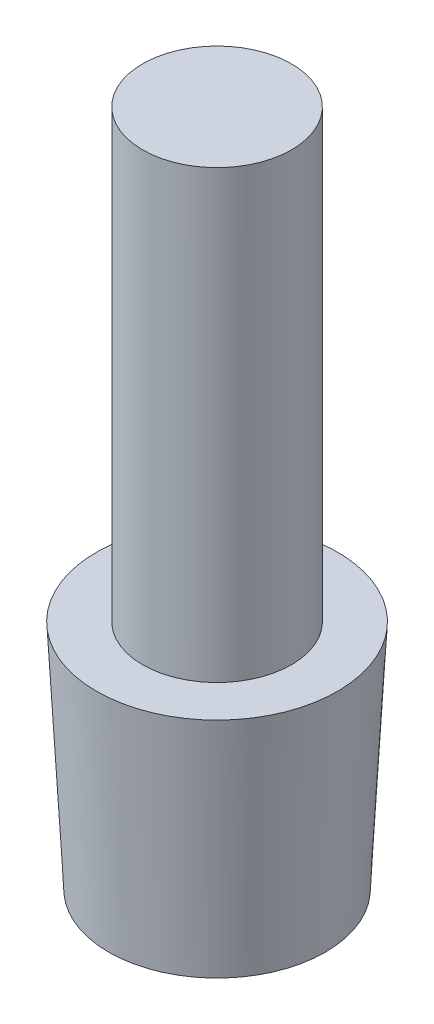
ISO-10303-21;
HEADER;
FILE_DESCRIPTION(('STEP AP214'),'2;1');
FILE_NAME('part.step','',(''),(''),'','','');
FILE_SCHEMA(('AUTOMOTIVE_DESIGN { 1 0 10303 214 1 1 1 1 }'));
ENDSEC;
DATA;
#1=APPLICATION_CONTEXT('core data for automotive mechanical design processes');
#2=APPLICATION_PROTOCOL_DEFINITION('international standard','automotive_design',2000,#1);
#3=PRODUCT_CONTEXT('',#1,'mechanical');
#4=PRODUCT('Part','Part','',(#3));
#5=PRODUCT_RELATED_PRODUCT_CATEGORY('part','',(#4));
#6=PRODUCT_DEFINITION_FORMATION('','',#4);
#7=PRODUCT_DEFINITION_CONTEXT('part definition',#1,'design');
#8=PRODUCT_DEFINITION('design','',#6,#7);
#9=PRODUCT_DEFINITION_SHAPE('','',#8);
#10=(LENGTH_UNIT() NAMED_UNIT(*) SI_UNIT(.MILLI.,.METRE.));
#11=(NAMED_UNIT(*) PLANE_ANGLE_UNIT() SI_UNIT($,.RADIAN.));
#12=(NAMED_UNIT(*) SI_UNIT($,.STERADIAN.) SOLID_ANGLE_UNIT());
#13=UNCERTAINTY_MEASURE_WITH_UNIT(LENGTH_MEASURE(1.E-05),#10,'distance_accuracy_value','');
#14=(GEOMETRIC_REPRESENTATION_CONTEXT(3) GLOBAL_UNCERTAINTY_ASSIGNED_CONTEXT((#13)) GLOBAL_UNIT_ASSIGNED_CONTEXT((#10,
#11,#12)) REPRESENTATION_CONTEXT('',''));
#15=CARTESIAN_POINT('',(0.,0.,0.));
#16=DIRECTION('',(0.,0.,1.));
#17=DIRECTION('',(1.,0.,0.));
#18=AXIS2_PLACEMENT_3D('',#15,#16,#17);
#19=CARTESIAN_POINT('',(0.,-26.1444340560536,0.));
#20=DIRECTION('',(0.,1.,0.));
#21=DIRECTION('',(1.,0.,0.));
#22=AXIS2_PLACEMENT_3D('',#19,#20,#21);
#23=PLANE('',#22);
#24=CARTESIAN_POINT('',(0.,-26.1444340560536,0.));
#25=DIRECTION('',(0.,1.,0.));
#26=DIRECTION('',(0.,0.,1.));
#27=AXIS2_PLACEMENT_3D('',#24,#25,#26);
#28=CIRCLE('',#27,8.);
#29=CARTESIAN_POINT('',(0.,-26.1444340560536,8.));
#30=VERTEX_POINT('',#29);
#31=EDGE_CURVE('E11',#30,#30,#28,.T.);
#32=ORIENTED_EDGE('',*,*,#31,.F.);
#33=EDGE_LOOP('',(#32));
#34=FACE_BOUND('',#33,.T.);
#35=ADVANCED_FACE('F17',(#34),#23,.F.);
#36=CARTESIAN_POINT('',(0.,-9.0164058224241,0.));
#37=DIRECTION('',(0.,1.,0.));
#38=DIRECTION('',(1.,0.,0.));
#39=AXIS2_PLACEMENT_3D('',#36,#37,#38);
#40=PLANE('',#39);
#41=CARTESIAN_POINT('',(0.,-9.0164058224241,0.));
#42=DIRECTION('',(0.,1.,0.));
#43=DIRECTION('',(0.,0.,1.));
#44=AXIS2_PLACEMENT_3D('',#41,#42,#43);
#45=CIRCLE('',#44,8.89764192322175);
#46=CARTESIAN_POINT('',(0.,-9.0164058224241,8.89764192322175));
#47=VERTEX_POINT('',#46);
#48=EDGE_CURVE('E25',#47,#47,#45,.T.);
#49=ORIENTED_EDGE('',*,*,#48,.T.);
#50=EDGE_LOOP('',(#49));
#51=FACE_BOUND('',#50,.T.);
#52=CARTESIAN_POINT('',(0.,-9.0164058224241,0.));
#53=DIRECTION('',(0.,-1.,0.));
#54=DIRECTION('',(0.,0.,1.));
#55=AXIS2_PLACEMENT_3D('',#52,#53,#54);
#56=CIRCLE('',#55,5.5);
#57=CARTESIAN_POINT('',(0.,-9.0164058224241,5.5));
#58=VERTEX_POINT('',#57);
#59=EDGE_CURVE('E50',#58,#58,#56,.T.);
#60=ORIENTED_EDGE('',*,*,#59,.T.);
#61=EDGE_LOOP('',(#60));
#62=FACE_BOUND('',#61,.T.);
#63=ADVANCED_FACE('F51',(#51,#62),#40,.T.);
#64=CARTESIAN_POINT('',(0.,-26.1444340560536,0.));
#65=DIRECTION('',(0.,1.,0.));
#66=DIRECTION('',(0.,0.,-1.));
#67=AXIS2_PLACEMENT_3D('',#64,#65,#66);
#68=CONICAL_SURFACE('',#67,8.,0.0523598775598306);
#69=ORIENTED_EDGE('',*,*,#31,.T.);
#70=EDGE_LOOP('',(#69));
#71=FACE_BOUND('',#70,.T.);
#72=ORIENTED_EDGE('',*,*,#48,.F.);
#73=EDGE_LOOP('',(#72));
#74=FACE_BOUND('',#73,.T.);
#75=ADVANCED_FACE('F87',(#71,#74),#68,.T.);
#76=CARTESIAN_POINT('',(0.,23.9028631995418,0.));
#77=DIRECTION('',(0.,1.,0.));
#78=DIRECTION('',(1.,0.,0.));
#79=AXIS2_PLACEMENT_3D('',#76,#77,#78);
#80=PLANE('',#79);
#81=CARTESIAN_POINT('',(0.,23.9028631995418,0.));
#82=DIRECTION('',(0.,1.,0.));
#83=DIRECTION('',(1.,0.,0.));
#84=AXIS2_PLACEMENT_3D('',#81,#82,#83);
#85=CIRCLE('',#84,5.5);
#86=CARTESIAN_POINT('',(5.5,23.9028631995418,0.));
#87=VERTEX_POINT('',#86);
#88=EDGE_CURVE('E54',#87,#87,#85,.T.);
#89=ORIENTED_EDGE('',*,*,#88,.T.);
#90=EDGE_LOOP('',(#89));
#91=FACE_BOUND('',#90,.T.);
#92=ADVANCED_FACE('F91',(#91),#80,.T.);
#93=CARTESIAN_POINT('',(0.,-26.1444340560536,0.));
#94=DIRECTION('',(0.,1.,0.));
#95=DIRECTION('',(0.,0.,1.));
#96=AXIS2_PLACEMENT_3D('',#93,#94,#95);
#97=CYLINDRICAL_SURFACE('',#96,5.5);
#98=ORIENTED_EDGE('',*,*,#88,.F.);
#99=EDGE_LOOP('',(#98));
#100=FACE_BOUND('',#99,.T.);
#101=ORIENTED_EDGE('',*,*,#59,.F.);
#102=EDGE_LOOP('',(#101));
#103=FACE_BOUND('',#102,.T.);
#104=ADVANCED_FACE('F95',(#100,#103),#97,.T.);
#105=CLOSED_SHELL('',(#35,#63,#75,#92,#104));
#106=MANIFOLD_SOLID_BREP('B1',#105);
#107=ADVANCED_BREP_SHAPE_REPRESENTATION('',(#18,#106),#14);
#108=SHAPE_DEFINITION_REPRESENTATION(#9,#107);
ENDSEC;
END-ISO-10303-21;
